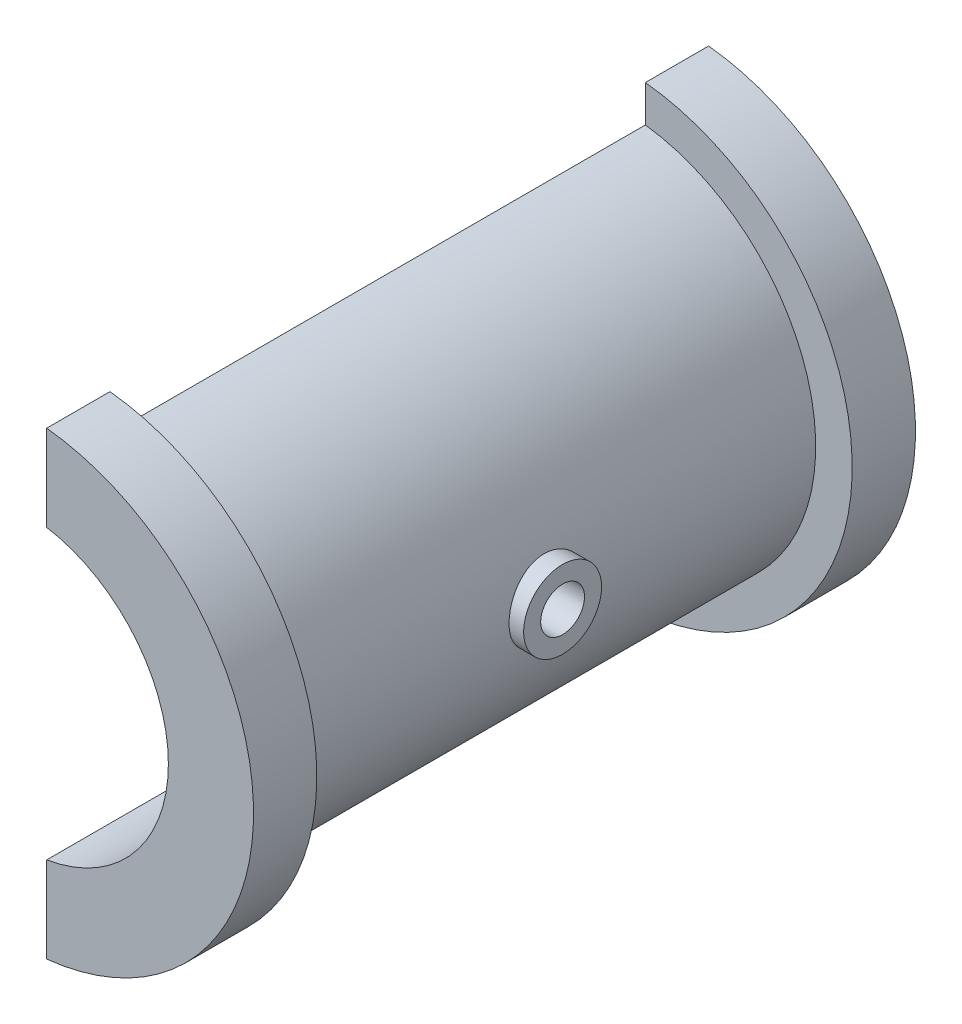
ISO-10303-21;
HEADER;
FILE_DESCRIPTION(('STEP AP214'),'2;1');
FILE_NAME('part.step','',(''),(''),'','','');
FILE_SCHEMA(('AUTOMOTIVE_DESIGN { 1 0 10303 214 1 1 1 1 }'));
ENDSEC;
DATA;
#1=APPLICATION_CONTEXT('core data for automotive mechanical design processes');
#2=APPLICATION_PROTOCOL_DEFINITION('international standard','automotive_design',2000,#1);
#3=PRODUCT_CONTEXT('',#1,'mechanical');
#4=PRODUCT('Part','Part','',(#3));
#5=PRODUCT_RELATED_PRODUCT_CATEGORY('part','',(#4));
#6=PRODUCT_DEFINITION_FORMATION('','',#4);
#7=PRODUCT_DEFINITION_CONTEXT('part definition',#1,'design');
#8=PRODUCT_DEFINITION('design','',#6,#7);
#9=PRODUCT_DEFINITION_SHAPE('','',#8);
#10=(LENGTH_UNIT() NAMED_UNIT(*) SI_UNIT(.MILLI.,.METRE.));
#11=(NAMED_UNIT(*) PLANE_ANGLE_UNIT() SI_UNIT($,.RADIAN.));
#12=(NAMED_UNIT(*) SI_UNIT($,.STERADIAN.) SOLID_ANGLE_UNIT());
#13=UNCERTAINTY_MEASURE_WITH_UNIT(LENGTH_MEASURE(1.E-05),#10,'distance_accuracy_value','');
#14=(GEOMETRIC_REPRESENTATION_CONTEXT(3) GLOBAL_UNCERTAINTY_ASSIGNED_CONTEXT((#13)) GLOBAL_UNIT_ASSIGNED_CONTEXT((#10,
#11,#12)) REPRESENTATION_CONTEXT('',''));
#15=CARTESIAN_POINT('',(0.,0.,0.));
#16=DIRECTION('',(0.,0.,1.));
#17=DIRECTION('',(1.,0.,0.));
#18=AXIS2_PLACEMENT_3D('',#15,#16,#17);
#19=CARTESIAN_POINT('',(0.,0.,55.));
#20=DIRECTION('',(0.,0.,-1.));
#21=DIRECTION('',(-1.,0.,0.));
#22=AXIS2_PLACEMENT_3D('',#19,#20,#21);
#23=CYLINDRICAL_SURFACE('',#22,30.);
#24=CARTESIAN_POINT('',(30.,0.,-4.50000000000001));
#25=CARTESIAN_POINT('',(29.9999959731389,0.251254633444927,-4.49998963855429));
#26=CARTESIAN_POINT('',(29.9968104761112,0.502655055246397,-4.47888599747811));
#27=CARTESIAN_POINT('',(29.9844094791956,0.998428883984741,-4.39505040005176));
#28=CARTESIAN_POINT('',(29.9751881081542,1.24279520692269,-4.33227791116533));
#29=CARTESIAN_POINT('',(29.9517516365858,1.71725425866558,-4.16702248509714));
#30=CARTESIAN_POINT('',(29.9375403111276,1.9473576234804,-4.06456956148216));
#31=CARTESIAN_POINT('',(29.9056942773517,2.38707128590577,-3.82293486174942));
#32=CARTESIAN_POINT('',(29.8880600445832,2.59668442417557,-3.68375818674792));
#33=CARTESIAN_POINT('',(29.8511751297436,2.99114015868638,-3.37146820518038));
#34=CARTESIAN_POINT('',(29.8319140167099,3.17579949667651,-3.19812463137539));
#35=CARTESIAN_POINT('',(29.7940278339972,3.51352472006846,-2.8229169333184));
#36=CARTESIAN_POINT('',(29.7754028009551,3.66658878818808,-2.62105116966444));
#37=CARTESIAN_POINT('',(29.7407963237618,3.93749188499829,-2.19329806943253));
#38=CARTESIAN_POINT('',(29.7248283592509,4.05515361111616,-1.967297259056));
#39=CARTESIAN_POINT('',(29.697486339188,4.25077896513169,-1.49846153806372));
#40=CARTESIAN_POINT('',(29.6861120332635,4.3287447566749,-1.25562754576833));
#41=CARTESIAN_POINT('',(29.6693476865602,4.44219596396734,-0.761945874384857));
#42=CARTESIAN_POINT('',(29.6639134722375,4.47799510921554,-0.511171819775932));
#43=CARTESIAN_POINT('',(29.6595104691175,4.50706872101798,-0.00712150203816632));
#44=CARTESIAN_POINT('',(29.6605413090944,4.50034562921389,0.246154616587482));
#45=CARTESIAN_POINT('',(29.6689115505723,4.44482199752363,0.745803240582428));
#46=CARTESIAN_POINT('',(29.6761985628465,4.39637087783252,0.99221557945441));
#47=CARTESIAN_POINT('',(29.696178243791,4.25931352211203,1.47337310661459));
#48=CARTESIAN_POINT('',(29.7088710653814,4.17070615013437,1.70811796464224));
#49=CARTESIAN_POINT('',(29.7382900663644,3.9554881058921,2.16034011384858));
#50=CARTESIAN_POINT('',(29.7550319029958,3.82872942849594,2.37774590727718));
#51=CARTESIAN_POINT('',(29.7906512272364,3.54091239386865,2.78833378734581));
#52=CARTESIAN_POINT('',(29.809528854975,3.37985178547435,2.98151428280812));
#53=CARTESIAN_POINT('',(29.8475241916863,3.02608479234744,3.34019298221916));
#54=CARTESIAN_POINT('',(29.8666424133844,2.83307798892601,3.50539497085903));
#55=CARTESIAN_POINT('',(29.9027894294539,2.42192126968256,3.80110780352179));
#56=CARTESIAN_POINT('',(29.9198182146753,2.20377124376451,3.9316184956317));
#57=CARTESIAN_POINT('',(29.9498854675618,1.74826379464106,4.15425925949865));
#58=CARTESIAN_POINT('',(29.9629215577628,1.51089503351034,4.2463664755209));
#59=CARTESIAN_POINT('',(29.9835147167121,1.02381954746118,4.38932816905614));
#60=CARTESIAN_POINT('',(29.991072155864,0.774113657857802,4.44018543544674));
#61=CARTESIAN_POINT('',(29.9998074340161,0.272008702930939,4.49880968945009));
#62=CARTESIAN_POINT('',(30.0010455627116,0.0196581956114106,4.50698391413798));
#63=CARTESIAN_POINT('',(29.9971668304568,-0.48281003298685,4.48109098406694));
#64=CARTESIAN_POINT('',(29.992050166241,-0.732927823145633,4.44702513699572));
#65=CARTESIAN_POINT('',(29.97607405846,-1.22259716229423,4.33795769946738));
#66=CARTESIAN_POINT('',(29.9652424562395,-1.46219388923952,4.26315451190747));
#67=CARTESIAN_POINT('',(29.9390470697511,-1.925444875929,4.07494500761474));
#68=CARTESIAN_POINT('',(29.923683072647,-2.14909838638531,3.96153687799912));
#69=CARTESIAN_POINT('',(29.8899804740606,-2.57590493787577,3.69838132630843));
#70=CARTESIAN_POINT('',(29.8716210488024,-2.77889702967471,3.54837557996169));
#71=CARTESIAN_POINT('',(29.8340358903649,-3.15697101953313,3.21664256511377));
#72=CARTESIAN_POINT('',(29.814810106886,-3.33205129438022,3.03491345302606));
#73=CARTESIAN_POINT('',(29.7774679291348,-3.65081354871587,2.64307940047054));
#74=CARTESIAN_POINT('',(29.7593620805276,-3.79422254242264,2.4327512244157));
#75=CARTESIAN_POINT('',(29.7264965731471,-4.04367387811753,1.9907518784647));
#76=CARTESIAN_POINT('',(29.7117368239688,-4.14971722969308,1.75908128543561));
#77=CARTESIAN_POINT('',(29.6873109902593,-4.32100401971831,1.28178739913061));
#78=CARTESIAN_POINT('',(29.6776269901931,-4.38639111424907,1.03621661708627));
#79=CARTESIAN_POINT('',(29.6644014689341,-4.4749664850476,0.537422953694681));
#80=CARTESIAN_POINT('',(29.6608595235531,-4.49815767549201,0.284200602015978));
#81=CARTESIAN_POINT('',(29.6603349783252,-4.5016136000832,-0.219987189947346));
#82=CARTESIAN_POINT('',(29.6632867900051,-4.48230756501939,-0.470949725270765));
#83=CARTESIAN_POINT('',(29.6752746183352,-4.40223688633137,-0.966015789970552));
#84=CARTESIAN_POINT('',(29.6843106252335,-4.34147230915882,-1.21011933034018));
#85=CARTESIAN_POINT('',(29.7074257833689,-4.18036120555996,-1.68441924670298));
#86=CARTESIAN_POINT('',(29.7215011114823,-4.08004467972943,-1.91462601130032));
#87=CARTESIAN_POINT('',(29.7531136367311,-3.84272002926928,-2.35501090140721));
#88=CARTESIAN_POINT('',(29.7706509510817,-3.70571066224506,-2.56518834841094));
#89=CARTESIAN_POINT('',(29.8074223009481,-3.39733012977493,-2.96172917392552));
#90=CARTESIAN_POINT('',(29.826671036459,-3.22564107119417,-3.14784399974121));
#91=CARTESIAN_POINT('',(29.8645736647991,-2.85344652324851,-3.48877366436348));
#92=CARTESIAN_POINT('',(29.8832274183228,-2.65293434505283,-3.64358121772849));
#93=CARTESIAN_POINT('',(29.9179555737156,-2.22748712263117,-3.9182630298221));
#94=CARTESIAN_POINT('',(29.9340152138646,-2.00242373029428,-4.03794032764425));
#95=CARTESIAN_POINT('',(29.9616008640888,-1.53525561074616,-4.23761555027415));
#96=CARTESIAN_POINT('',(29.9731315669727,-1.29316883129011,-4.31765457016107));
#97=CARTESIAN_POINT('',(29.9877281778452,-0.874997183667988,-4.41762402813033));
#98=CARTESIAN_POINT('',(29.9923064753867,-0.701493400485836,-4.44846780461644));
#99=CARTESIAN_POINT('',(29.9984437784369,-0.352016914800376,-4.48965929313794));
#100=CARTESIAN_POINT('',(30.0000028214632,-0.176044243003252,-4.50000725985765));
#101=CARTESIAN_POINT('',(30.,0.,-4.50000000000001));
#102=B_SPLINE_CURVE_WITH_KNOTS('',3,(#24,#25,#26,#27,#28,#29,#30,#31,#32,#33,#34,#35,#36,#37,
#38,#39,#40,#41,#42,#43,#44,#45,#46,#47,#48,#49,#50,#51,#52,#53,#54,#55,#56,#57,#58,#59,#60,#61,
#62,#63,#64,#65,#66,#67,#68,#69,#70,#71,#72,#73,#74,#75,#76,#77,#78,#79,#80,#81,#82,#83,#84,#85,
#86,#87,#88,#89,#90,#91,#92,#93,#94,#95,#96,#97,#98,#99,#100,#101),.UNSPECIFIED.,.T.,.F.,(4,2,2,
2,2,2,2,2,2,2,2,2,2,2,2,2,2,2,2,2,2,2,2,2,2,2,2,2,2,2,2,2,2,2,2,2,2,2,4),(0.,0.753120615094991,
1.50697488878745,2.26026007074972,3.0134406725928,3.77188248410531,4.53036790717741,
5.29259107186126,6.05477268676519,6.81124693817774,7.56767775296949,8.31783531587241,
9.06801410071086,9.82114150428479,10.5743183492561,11.3350287376623,12.0957424571601,
12.8569082695463,13.6180226158021,14.3718617563277,15.1256775597347,15.8758544689785,
16.6260666112882,17.3817356411073,18.1374486008589,18.8994409975402,19.661412804265,
20.4206767037151,21.1798881641153,21.931466647832,22.683043926887,23.4340522195244,
24.1850859440064,24.9433448989717,25.701780104062,26.4643897015421,27.2262069978433,
27.7538955593643,28.2815775636988),.UNSPECIFIED.);
#103=CARTESIAN_POINT('',(30.,0.,-4.50000000000001));
#104=VERTEX_POINT('',#103);
#105=EDGE_CURVE('E49',#104,#104,#102,.T.);
#106=ORIENTED_EDGE('',*,*,#105,.T.);
#107=EDGE_LOOP('',(#106));
#108=FACE_BOUND('',#107,.T.);
#109=DIRECTION('',(0.,0.,-1.));
#110=VECTOR('',#109,1.);
#111=CARTESIAN_POINT('',(5.,29.5803989154981,55.));
#112=LINE('',#111,#110);
#113=CARTESIAN_POINT('',(5.,29.5803989154981,68.));
#114=VERTEX_POINT('',#113);
#115=CARTESIAN_POINT('',(5.,29.5803989154981,-68.));
#116=VERTEX_POINT('',#115);
#117=EDGE_CURVE('E111',#114,#116,#112,.T.);
#118=ORIENTED_EDGE('',*,*,#117,.T.);
#119=CARTESIAN_POINT('',(0.,0.,-68.));
#120=DIRECTION('',(0.,0.,-1.));
#121=DIRECTION('',(1.,0.,0.));
#122=AXIS2_PLACEMENT_3D('',#119,#120,#121);
#123=CIRCLE('',#122,30.);
#124=CARTESIAN_POINT('',(5.,-29.5803989154981,-68.));
#125=VERTEX_POINT('',#124);
#126=EDGE_CURVE('E113',#116,#125,#123,.T.);
#127=ORIENTED_EDGE('',*,*,#126,.T.);
#128=DIRECTION('',(0.,0.,-1.));
#129=VECTOR('',#128,1.);
#130=CARTESIAN_POINT('',(5.,-29.5803989154981,55.));
#131=LINE('',#130,#129);
#132=CARTESIAN_POINT('',(5.,-29.5803989154981,68.));
#133=VERTEX_POINT('',#132);
#134=EDGE_CURVE('E11',#133,#125,#131,.T.);
#135=ORIENTED_EDGE('',*,*,#134,.F.);
#136=CARTESIAN_POINT('',(0.,0.,68.));
#137=DIRECTION('',(0.,0.,-1.));
#138=DIRECTION('',(1.,0.,0.));
#139=AXIS2_PLACEMENT_3D('',#136,#137,#138);
#140=CIRCLE('',#139,30.);
#141=EDGE_CURVE('E116',#114,#133,#140,.T.);
#142=ORIENTED_EDGE('',*,*,#141,.F.);
#143=EDGE_LOOP('',(#118,#127,#135,#142));
#144=FACE_BOUND('',#143,.T.);
#145=ADVANCED_FACE('F45',(#108,#144),#23,.F.);
#146=CARTESIAN_POINT('',(5.,-29.5803989154981,55.));
#147=DIRECTION('',(1.,0.,0.));
#148=DIRECTION('',(0.,1.,0.));
#149=AXIS2_PLACEMENT_3D('',#146,#147,#148);
#150=PLANE('',#149);
#151=ORIENTED_EDGE('',*,*,#134,.T.);
#152=DIRECTION('',(0.,-1.,0.));
#153=VECTOR('',#152,1.);
#154=CARTESIAN_POINT('',(5.,-29.5803989154981,-68.));
#155=LINE('',#154,#153);
#156=CARTESIAN_POINT('',(5.,-47.236109069228,-68.));
#157=VERTEX_POINT('',#156);
#158=EDGE_CURVE('E132',#125,#157,#155,.T.);
#159=ORIENTED_EDGE('',*,*,#158,.T.);
#160=DIRECTION('',(0.,0.,1.));
#161=VECTOR('',#160,1.);
#162=CARTESIAN_POINT('',(5.,-47.236109069228,-68.));
#163=LINE('',#162,#161);
#164=CARTESIAN_POINT('',(5.,-47.236109069228,-55.));
#165=VERTEX_POINT('',#164);
#166=EDGE_CURVE('E149',#157,#165,#163,.T.);
#167=ORIENTED_EDGE('',*,*,#166,.T.);
#168=DIRECTION('',(0.,-1.,0.));
#169=VECTOR('',#168,1.);
#170=CARTESIAN_POINT('',(5.,-29.5803989154981,-55.));
#171=LINE('',#170,#169);
#172=CARTESIAN_POINT('',(5.,-39.6862696659689,-55.));
#173=VERTEX_POINT('',#172);
#174=EDGE_CURVE('E134',#173,#165,#171,.T.);
#175=ORIENTED_EDGE('',*,*,#174,.F.);
#176=DIRECTION('',(0.,0.,-1.));
#177=VECTOR('',#176,1.);
#178=CARTESIAN_POINT('',(5.00000000000001,-39.6862696659689,55.));
#179=LINE('',#178,#177);
#180=CARTESIAN_POINT('',(5.00000000000001,-39.6862696659689,55.));
#181=VERTEX_POINT('',#180);
#182=EDGE_CURVE('E60',#181,#173,#179,.T.);
#183=ORIENTED_EDGE('',*,*,#182,.F.);
#184=DIRECTION('',(0.,-1.,0.));
#185=VECTOR('',#184,1.);
#186=CARTESIAN_POINT('',(5.,-29.5803989154981,55.));
#187=LINE('',#186,#185);
#188=CARTESIAN_POINT('',(5.,-47.236109069228,55.));
#189=VERTEX_POINT('',#188);
#190=EDGE_CURVE('E165',#181,#189,#187,.T.);
#191=ORIENTED_EDGE('',*,*,#190,.T.);
#192=DIRECTION('',(0.,0.,-1.));
#193=VECTOR('',#192,1.);
#194=CARTESIAN_POINT('',(5.,-47.236109069228,68.));
#195=LINE('',#194,#193);
#196=CARTESIAN_POINT('',(5.,-47.236109069228,68.));
#197=VERTEX_POINT('',#196);
#198=EDGE_CURVE('E190',#197,#189,#195,.T.);
#199=ORIENTED_EDGE('',*,*,#198,.F.);
#200=DIRECTION('',(0.,-1.,0.));
#201=VECTOR('',#200,1.);
#202=CARTESIAN_POINT('',(5.,-29.5803989154981,68.));
#203=LINE('',#202,#201);
#204=EDGE_CURVE('E168',#133,#197,#203,.T.);
#205=ORIENTED_EDGE('',*,*,#204,.F.);
#206=EDGE_LOOP('',(#151,#159,#167,#175,#183,#191,#199,#205));
#207=FACE_BOUND('',#206,.T.);
#208=ADVANCED_FACE('F212',(#207),#150,.F.);
#209=CARTESIAN_POINT('',(0.,0.,55.));
#210=DIRECTION('',(0.,0.,-1.));
#211=DIRECTION('',(-1.,0.,0.));
#212=AXIS2_PLACEMENT_3D('',#209,#210,#211);
#213=CYLINDRICAL_SURFACE('',#212,40.);
#214=CARTESIAN_POINT('',(40.,0.,-8.));
#215=CARTESIAN_POINT('',(40.0000022503977,0.222382202996885,-8.00000443100729));
#216=CARTESIAN_POINT('',(39.9981422711815,0.444708909688722,-7.99072501381524));
#217=CARTESIAN_POINT('',(39.9907591944899,0.887823377686245,-7.95368960994421));
#218=CARTESIAN_POINT('',(39.9852354787933,1.10861087290957,-7.92593050498773));
#219=CARTESIAN_POINT('',(39.9706723880411,1.54709944124005,-7.85213029959485));
#220=CARTESIAN_POINT('',(39.961631196122,1.76479885895029,-7.80607975091755));
#221=CARTESIAN_POINT('',(39.9402820100275,2.19553774317657,-7.69604055574548));
#222=CARTESIAN_POINT('',(39.9279728152493,2.40857546587516,-7.6320453162221));
#223=CARTESIAN_POINT('',(39.9004487443211,2.82813260013869,-7.48671418033354));
#224=CARTESIAN_POINT('',(39.8852377987276,3.03466039373949,-7.40540172379848));
#225=CARTESIAN_POINT('',(39.8523111594353,3.44015899794314,-7.22595890507998));
#226=CARTESIAN_POINT('',(39.8345945304007,3.63912695121905,-7.1278222597515));
#227=CARTESIAN_POINT('',(39.7971537912997,4.02798849333058,-6.91551569000785));
#228=CARTESIAN_POINT('',(39.7774306699057,4.21788648413403,-6.80135365145924));
#229=CARTESIAN_POINT('',(39.7364958380736,4.58753748621129,-6.55770727039044));
#230=CARTESIAN_POINT('',(39.7152834516751,4.76728582301152,-6.42821595154674));
#231=CARTESIAN_POINT('',(39.6716894668911,5.11747697068662,-6.15317791835462));
#232=CARTESIAN_POINT('',(39.6492968025577,5.2877803632885,-6.00745541560296));
#233=CARTESIAN_POINT('',(39.6042147817473,5.61547151660434,-5.70233102363309));
#234=CARTESIAN_POINT('',(39.5815255597968,5.77286491297785,-5.54293516614664));
#235=CARTESIAN_POINT('',(39.5364613058424,6.07382890620943,-5.21140561166009));
#236=CARTESIAN_POINT('',(39.5140864286214,6.21739288410144,-5.03926588427414));
#237=CARTESIAN_POINT('',(39.4702971900764,6.48957938998095,-4.68353492782497));
#238=CARTESIAN_POINT('',(39.4488824945439,6.61820714196465,-4.4999477372902));
#239=CARTESIAN_POINT('',(39.4074190918586,6.86080252294502,-4.12074265124599));
#240=CARTESIAN_POINT('',(39.3873849607066,6.97462249301908,-3.92502865026222));
#241=CARTESIAN_POINT('',(39.3494895115417,7.18534213767996,-3.52449493567151));
#242=CARTESIAN_POINT('',(39.331628159576,7.28224207667738,-3.31967536442076));
#243=CARTESIAN_POINT('',(39.2986075122845,7.4583833678868,-2.90237907956402));
#244=CARTESIAN_POINT('',(39.2834480695741,7.53762568335291,-2.6899027843806));
#245=CARTESIAN_POINT('',(39.2562856809014,7.67783429716927,-2.25881195596571));
#246=CARTESIAN_POINT('',(39.244282621556,7.73880125201603,-2.04019764353573));
#247=CARTESIAN_POINT('',(39.2239295795769,7.84130382956527,-1.60127653730711));
#248=CARTESIAN_POINT('',(39.2155344264807,7.88308020170019,-1.38102805091707));
#249=CARTESIAN_POINT('',(39.2024281229502,7.9480015554449,-0.937775607562832));
#250=CARTESIAN_POINT('',(39.1977155964609,7.97115349637861,-0.714772711485412));
#251=CARTESIAN_POINT('',(39.1921111780117,7.99866360552878,-0.267541765716385));
#252=CARTESIAN_POINT('',(39.1912196424865,8.00302002043607,-0.0433136036812819));
#253=CARTESIAN_POINT('',(39.1932851968663,7.9928982430403,0.404698313098166));
#254=CARTESIAN_POINT('',(39.1962422545112,7.97842020861341,0.628482071551891));
#255=CARTESIAN_POINT('',(39.205841404869,7.93111398129365,1.07055692502244));
#256=CARTESIAN_POINT('',(39.2124264980905,7.89856956782374,1.28887969863994));
#257=CARTESIAN_POINT('',(39.2290525306891,7.81557589995774,1.72203913505801));
#258=CARTESIAN_POINT('',(39.2390946679849,7.76512043892019,1.93687456238231));
#259=CARTESIAN_POINT('',(39.2623403346724,7.64671600346994,2.36141550199566));
#260=CARTESIAN_POINT('',(39.2755428277978,7.57877276267294,2.57112267102709));
#261=CARTESIAN_POINT('',(39.3047394534056,7.42586773982546,2.98412380399879));
#262=CARTESIAN_POINT('',(39.3207346248761,7.34089962209752,3.18741534771573));
#263=CARTESIAN_POINT('',(39.3551749086605,7.15397048373112,3.587445735331));
#264=CARTESIAN_POINT('',(39.3736353766776,7.05190184161522,3.78413295862283));
#265=CARTESIAN_POINT('',(39.4124052045585,6.83189481273278,4.16823715731557));
#266=CARTESIAN_POINT('',(39.4327146319165,6.7139558465627,4.35565379391841));
#267=CARTESIAN_POINT('',(39.4746189126864,6.46302077871785,4.71998871872312));
#268=CARTESIAN_POINT('',(39.4962138687299,6.33002347407536,4.89690616645156));
#269=CARTESIAN_POINT('',(39.5400941887543,6.04987994409967,5.23906893990563));
#270=CARTESIAN_POINT('',(39.5623795608308,5.9027335528142,5.40431412868984));
#271=CARTESIAN_POINT('',(39.6074360180536,5.59249627412449,5.72491347445412));
#272=CARTESIAN_POINT('',(39.6302086182823,5.42916581642201,5.88003568903051));
#273=CARTESIAN_POINT('',(39.6751996579545,5.08996999143125,6.17599109660391));
#274=CARTESIAN_POINT('',(39.6974181077143,4.91410485772875,6.31682455575579));
#275=CARTESIAN_POINT('',(39.7406835999453,4.55098875723055,6.58325307433265));
#276=CARTESIAN_POINT('',(39.7617303798239,4.36373525761476,6.70884472517423));
#277=CARTESIAN_POINT('',(39.8020486554585,3.97922978106771,6.94380829067182));
#278=CARTESIAN_POINT('',(39.8213208252184,3.78198164463424,7.05318637301079));
#279=CARTESIAN_POINT('',(39.8575916354611,3.37838910085915,7.25517100915874));
#280=CARTESIAN_POINT('',(39.8745857688793,3.17202770440714,7.34774443964797));
#281=CARTESIAN_POINT('',(39.9057672288933,2.7520988608886,7.51511949856216));
#282=CARTESIAN_POINT('',(39.9199555712297,2.53853405446499,7.58992756030767));
#283=CARTESIAN_POINT('',(39.9451283654844,2.10564163314498,7.72123281973584));
#284=CARTESIAN_POINT('',(39.9561125476091,1.88631353466729,7.77772847553919));
#285=CARTESIAN_POINT('',(39.9745588864157,1.44351590634491,7.87194359431046));
#286=CARTESIAN_POINT('',(39.9820210973501,1.22004644034896,7.90966334650283));
#287=CARTESIAN_POINT('',(39.9931141484704,0.774384931428699,7.96554555984256));
#288=CARTESIAN_POINT('',(39.9968070216775,0.552234104223998,7.98402477348316));
#289=CARTESIAN_POINT('',(40.0004756324195,0.107135261602876,8.00238295431595));
#290=CARTESIAN_POINT('',(40.0004514055167,-0.115812746166326,8.00226209945932));
#291=CARTESIAN_POINT('',(39.9966866100009,-0.560877232390089,7.98342182938795));
#292=CARTESIAN_POINT('',(39.99294623992,-0.782993754629819,7.96470340773397));
#293=CARTESIAN_POINT('',(39.9818545211136,-1.22480186071782,7.90882035880861));
#294=CARTESIAN_POINT('',(39.9745031795073,-1.44449344934609,7.87165576790473));
#295=CARTESIAN_POINT('',(39.9564787248489,-1.87787554125075,7.77960195922915));
#296=CARTESIAN_POINT('',(39.9458367537215,-2.09160263678705,7.72487873749604));
#297=CARTESIAN_POINT('',(39.9214968946398,-2.51372209762288,7.59801211562015));
#298=CARTESIAN_POINT('',(39.9077979640979,-2.72211261576743,7.52586277153862));
#299=CARTESIAN_POINT('',(39.877722916677,-3.13200198992557,7.3647162026783));
#300=CARTESIAN_POINT('',(39.861347575322,-3.33350282192162,7.27572385719616));
#301=CARTESIAN_POINT('',(39.8263526743327,-3.72839698843742,7.08148934994883));
#302=CARTESIAN_POINT('',(39.8077323215374,-3.92178742484404,6.97624144139211));
#303=CARTESIAN_POINT('',(39.7685164512439,-4.30138936968721,6.74889500361166));
#304=CARTESIAN_POINT('',(39.7478998165188,-4.48748613441774,6.62660851709688));
#305=CARTESIAN_POINT('',(39.7054488099911,-4.84875465286749,6.36702869354888));
#306=CARTESIAN_POINT('',(39.6836144213363,-5.023926255326,6.2297351488128));
#307=CARTESIAN_POINT('',(39.6393195903224,-5.36222509348534,5.94104379760852));
#308=CARTESIAN_POINT('',(39.6168589921477,-5.52534929399764,5.78964245844431));
#309=CARTESIAN_POINT('',(39.5719396753391,-5.83837217393115,5.47383100242076));
#310=CARTESIAN_POINT('',(39.5494809583073,-5.98827496622159,5.30942496142015));
#311=CARTESIAN_POINT('',(39.5048345293274,-6.2761128272644,4.96602168373043));
#312=CARTESIAN_POINT('',(39.4826563408313,-6.41382763461222,4.78683849920848));
#313=CARTESIAN_POINT('',(39.4395671785454,-6.67367154431948,4.41736517310698));
#314=CARTESIAN_POINT('',(39.41865619115,-6.79580081403156,4.22707515082117));
#315=CARTESIAN_POINT('',(39.3787064281191,-7.02359296525607,3.8366929245437));
#316=CARTESIAN_POINT('',(39.3596676472848,-7.12925589249241,3.63660074777279));
#317=CARTESIAN_POINT('',(39.3240213544226,-7.32332467616792,3.22801249016853));
#318=CARTESIAN_POINT('',(39.3074137624426,-7.41173110013704,3.01951668598491));
#319=CARTESIAN_POINT('',(39.277199690298,-7.57020898101907,2.59666286196399));
#320=CARTESIAN_POINT('',(39.2635784845912,-7.64037073468745,2.38233974509702));
#321=CARTESIAN_POINT('',(39.2396423236709,-7.76236677307734,1.94844277944978));
#322=CARTESIAN_POINT('',(39.2293261354949,-7.81420789319936,1.72887092168049));
#323=CARTESIAN_POINT('',(39.2123039242266,-7.89918364314085,1.28598005737815));
#324=CARTESIAN_POINT('',(39.2055981765014,-7.93231684612348,1.06266076636875));
#325=CARTESIAN_POINT('',(39.1960025280241,-7.97959714844253,0.613940864784894));
#326=CARTESIAN_POINT('',(39.193112573146,-7.99374451708801,0.388540283778642));
#327=CARTESIAN_POINT('',(39.1912538071164,-8.00285222304826,-0.0585254711402085));
#328=CARTESIAN_POINT('',(39.1922140705528,-7.99815961215707,-0.280183357044461));
#329=CARTESIAN_POINT('',(39.1978690026941,-7.97039936405038,-0.722375483493523));
#330=CARTESIAN_POINT('',(39.2025649688353,-7.94732534283514,-0.942909306857521));
#331=CARTESIAN_POINT('',(39.2155532178888,-7.88298545810057,-1.38115178257743));
#332=CARTESIAN_POINT('',(39.2238447650534,-7.84172331630651,-1.59886100353747));
#333=CARTESIAN_POINT('',(39.2437816557745,-7.74133170814247,-2.02996747202559));
#334=CARTESIAN_POINT('',(39.2554270856983,-7.68220178164945,-2.24336460835986));
#335=CARTESIAN_POINT('',(39.2817018891557,-7.5466974708152,-2.66383702290788));
#336=CARTESIAN_POINT('',(39.2963238364281,-7.47036595381018,-2.87092658799139));
#337=CARTESIAN_POINT('',(39.3281533929634,-7.3009434128743,-3.27792855697227));
#338=CARTESIAN_POINT('',(39.3453610481826,-7.20785209106253,-3.47784083322813));
#339=CARTESIAN_POINT('',(39.3818768388285,-7.00559277336041,-3.86913031730106));
#340=CARTESIAN_POINT('',(39.4011847520438,-6.89642647780227,-4.06050842503486));
#341=CARTESIAN_POINT('',(39.4413744461936,-6.66273496653415,-4.43355661666274));
#342=CARTESIAN_POINT('',(39.4622567439425,-6.53820469876637,-4.61522347896127));
#343=CARTESIAN_POINT('',(39.5053786272049,-6.27243809241453,-4.97057043512849));
#344=CARTESIAN_POINT('',(39.5276351458069,-6.13095577146573,-5.14406455077253));
#345=CARTESIAN_POINT('',(39.5725558604418,-5.83398396014617,-5.47856305349385));
#346=CARTESIAN_POINT('',(39.5952200605015,-5.67849433136303,-5.63956731712415));
#347=CARTESIAN_POINT('',(39.640335009379,-5.35449315031708,-5.94806346904203));
#348=CARTESIAN_POINT('',(39.6627856688701,-5.18597639634956,-6.0955499077774));
#349=CARTESIAN_POINT('',(39.7068343062859,-4.83716807079332,-6.3758804430836));
#350=CARTESIAN_POINT('',(39.7284325782508,-4.65688061761436,-6.50872961777478));
#351=CARTESIAN_POINT('',(39.7704137619116,-4.28366939255559,-6.7602783089246));
#352=CARTESIAN_POINT('',(39.7907809287494,-4.09062965973461,-6.87880850451553));
#353=CARTESIAN_POINT('',(39.8294566689227,-3.69511146732796,-7.09911105122752));
#354=CARTESIAN_POINT('',(39.8477659996985,-3.49263651969487,-7.20088957468729));
#355=CARTESIAN_POINT('',(39.8818029524045,-3.07971732211681,-7.38691920570563));
#356=CARTESIAN_POINT('',(39.8975321343332,-2.86927798300794,-7.47118091250707));
#357=CARTESIAN_POINT('',(39.925969672351,-2.44189507967102,-7.6215802891145));
#358=CARTESIAN_POINT('',(39.9386786103523,-2.22495277745859,-7.68772145059331));
#359=CARTESIAN_POINT('',(39.9660939650464,-1.6787234509097,-7.82915700351603));
#360=CARTESIAN_POINT('',(39.9787427045036,-1.34633199046821,-7.89313569708758));
#361=CARTESIAN_POINT('',(39.9956938793146,-0.675917525830283,-7.97855315112737));
#362=CARTESIAN_POINT('',(39.999996580673,-0.337894701462863,-7.99999326738442));
#363=CARTESIAN_POINT('',(40.,0.,-8.));
#364=B_SPLINE_CURVE_WITH_KNOTS('',3,(#214,#215,#216,#217,#218,#219,#220,#221,#222,#223,#224,
#225,#226,#227,#228,#229,#230,#231,#232,#233,#234,#235,#236,#237,#238,#239,#240,#241,#242,#243,
#244,#245,#246,#247,#248,#249,#250,#251,#252,#253,#254,#255,#256,#257,#258,#259,#260,#261,#262,
#263,#264,#265,#266,#267,#268,#269,#270,#271,#272,#273,#274,#275,#276,#277,#278,#279,#280,#281,
#282,#283,#284,#285,#286,#287,#288,#289,#290,#291,#292,#293,#294,#295,#296,#297,#298,#299,#300,
#301,#302,#303,#304,#305,#306,#307,#308,#309,#310,#311,#312,#313,#314,#315,#316,#317,#318,#319,
#320,#321,#322,#323,#324,#325,#326,#327,#328,#329,#330,#331,#332,#333,#334,#335,#336,#337,#338,
#339,#340,#341,#342,#343,#344,#345,#346,#347,#348,#349,#350,#351,#352,#353,#354,#355,#356,#357,
#358,#359,#360,#361,#362,#363),.UNSPECIFIED.,.T.,.F.,(4,2,2,2,2,2,2,2,2,2,2,2,2,2,2,2,2,2,2,2,2,
2,2,2,2,2,2,2,2,2,2,2,2,2,2,2,2,2,2,2,2,2,2,2,2,2,2,2,2,2,2,2,2,2,2,2,2,2,2,2,2,2,2,2,2,2,2,2,2,
2,2,2,2,2,4),(0.,0.666849907451946,1.33381236822939,2.00111978996802,2.66867270797161,
3.33532773384513,4.00223227257719,4.66880978011991,5.33569182042637,6.0106677572235,
6.68534745793188,7.36034848251392,8.035112707519,8.71615994590496,9.39719654056212,
10.0781959743874,10.7591709420826,11.4313525330265,12.1032828354814,12.7752758164746,
13.4472631646517,14.1089822352936,14.7709308329132,15.4326626771736,16.0946412387773,
16.7609542304084,17.4272915548062,18.0936821486017,18.7600805593353,19.438489468032,
20.1168857377692,20.7954334413593,21.4737223575914,22.1533340527271,22.8326992655184,
23.5121216650733,24.191533598466,24.8595746436197,25.52760929747,26.1956082640004,
26.8636059135443,27.5254658280727,28.1875518183939,28.8494462999214,29.5115753173536,
30.1816917593008,30.8518174770647,31.5221114525292,32.1921961744184,32.8726166625244,
33.5530298438726,34.2334411358085,34.913830046682,35.5907845633699,36.2674862420433,
36.944239525206,37.6209832087002,38.2853183063896,38.9498842332148,39.6143142370088,
40.2787613523593,40.9415705881075,41.604391605479,42.2671425631759,42.9301120336978,
43.6042441680847,44.2783829645991,44.9527923477468,45.6269670157198,46.3084627219637,
46.9897067587031,47.6705373741926,48.3512367070753,49.3645022888653,50.3777355753535),.UNSPECIFIED.);
#365=CARTESIAN_POINT('',(40.,0.,-8.));
#366=VERTEX_POINT('',#365);
#367=EDGE_CURVE('E154',#366,#366,#364,.T.);
#368=ORIENTED_EDGE('',*,*,#367,.F.);
#369=EDGE_LOOP('',(#368));
#370=FACE_BOUND('',#369,.T.);
#371=CARTESIAN_POINT('',(0.,0.,-55.));
#372=DIRECTION('',(0.,0.,1.));
#373=DIRECTION('',(-1.,0.,0.));
#374=AXIS2_PLACEMENT_3D('',#371,#372,#373);
#375=CIRCLE('',#374,40.);
#376=CARTESIAN_POINT('',(4.99999999999999,39.6862696659689,-55.));
#377=VERTEX_POINT('',#376);
#378=EDGE_CURVE('E194',#173,#377,#375,.T.);
#379=ORIENTED_EDGE('',*,*,#378,.T.);
#380=DIRECTION('',(0.,0.,-1.));
#381=VECTOR('',#380,1.);
#382=CARTESIAN_POINT('',(4.99999999999999,39.6862696659689,55.));
#383=LINE('',#382,#381);
#384=CARTESIAN_POINT('',(5.,39.6862696659689,55.));
#385=VERTEX_POINT('',#384);
#386=EDGE_CURVE('E122',#385,#377,#383,.T.);
#387=ORIENTED_EDGE('',*,*,#386,.F.);
#388=CARTESIAN_POINT('',(0.,0.,55.));
#389=DIRECTION('',(0.,0.,1.));
#390=DIRECTION('',(-1.,0.,0.));
#391=AXIS2_PLACEMENT_3D('',#388,#389,#390);
#392=CIRCLE('',#391,40.);
#393=EDGE_CURVE('E123',#181,#385,#392,.T.);
#394=ORIENTED_EDGE('',*,*,#393,.F.);
#395=ORIENTED_EDGE('',*,*,#182,.T.);
#396=EDGE_LOOP('',(#379,#387,#394,#395));
#397=FACE_BOUND('',#396,.T.);
#398=ADVANCED_FACE('F205',(#370,#397),#213,.T.);
#399=CARTESIAN_POINT('',(4.99999999999999,39.6862696659689,55.));
#400=DIRECTION('',(1.,0.,0.));
#401=DIRECTION('',(0.,1.,0.));
#402=AXIS2_PLACEMENT_3D('',#399,#400,#401);
#403=PLANE('',#402);
#404=ORIENTED_EDGE('',*,*,#386,.T.);
#405=DIRECTION('',(0.,-1.,0.));
#406=VECTOR('',#405,1.);
#407=CARTESIAN_POINT('',(5.,29.5803989154981,-55.));
#408=LINE('',#407,#406);
#409=CARTESIAN_POINT('',(5.,47.236109069228,-55.));
#410=VERTEX_POINT('',#409);
#411=EDGE_CURVE('E150',#410,#377,#408,.T.);
#412=ORIENTED_EDGE('',*,*,#411,.F.);
#413=DIRECTION('',(0.,0.,1.));
#414=VECTOR('',#413,1.);
#415=CARTESIAN_POINT('',(5.,47.236109069228,-68.));
#416=LINE('',#415,#414);
#417=CARTESIAN_POINT('',(5.,47.236109069228,-68.));
#418=VERTEX_POINT('',#417);
#419=EDGE_CURVE('E139',#418,#410,#416,.T.);
#420=ORIENTED_EDGE('',*,*,#419,.F.);
#421=DIRECTION('',(0.,-1.,0.));
#422=VECTOR('',#421,1.);
#423=CARTESIAN_POINT('',(5.,29.5803989154981,-68.));
#424=LINE('',#423,#422);
#425=EDGE_CURVE('E129',#418,#116,#424,.T.);
#426=ORIENTED_EDGE('',*,*,#425,.T.);
#427=ORIENTED_EDGE('',*,*,#117,.F.);
#428=DIRECTION('',(0.,-1.,0.));
#429=VECTOR('',#428,1.);
#430=CARTESIAN_POINT('',(5.,29.5803989154981,68.));
#431=LINE('',#430,#429);
#432=CARTESIAN_POINT('',(5.,47.236109069228,68.));
#433=VERTEX_POINT('',#432);
#434=EDGE_CURVE('E175',#433,#114,#431,.T.);
#435=ORIENTED_EDGE('',*,*,#434,.F.);
#436=DIRECTION('',(0.,0.,-1.));
#437=VECTOR('',#436,1.);
#438=CARTESIAN_POINT('',(5.,47.236109069228,68.));
#439=LINE('',#438,#437);
#440=CARTESIAN_POINT('',(5.,47.236109069228,55.));
#441=VERTEX_POINT('',#440);
#442=EDGE_CURVE('E178',#433,#441,#439,.T.);
#443=ORIENTED_EDGE('',*,*,#442,.T.);
#444=DIRECTION('',(0.,-1.,0.));
#445=VECTOR('',#444,1.);
#446=CARTESIAN_POINT('',(5.,29.5803989154981,55.));
#447=LINE('',#446,#445);
#448=EDGE_CURVE('E169',#441,#385,#447,.T.);
#449=ORIENTED_EDGE('',*,*,#448,.T.);
#450=EDGE_LOOP('',(#404,#412,#420,#426,#427,#435,#443,#449));
#451=FACE_BOUND('',#450,.T.);
#452=ADVANCED_FACE('F137',(#451),#403,.F.);
#453=CARTESIAN_POINT('',(0.,0.,68.));
#454=DIRECTION('',(0.,0.,-1.));
#455=DIRECTION('',(-1.,0.,0.));
#456=AXIS2_PLACEMENT_3D('',#453,#454,#455);
#457=CYLINDRICAL_SURFACE('',#456,47.5);
#458=CARTESIAN_POINT('',(0.,0.,55.));
#459=DIRECTION('',(0.,0.,1.));
#460=DIRECTION('',(-1.,0.,0.));
#461=AXIS2_PLACEMENT_3D('',#458,#459,#460);
#462=CIRCLE('',#461,47.5);
#463=EDGE_CURVE('E181',#189,#441,#462,.T.);
#464=ORIENTED_EDGE('',*,*,#463,.T.);
#465=ORIENTED_EDGE('',*,*,#442,.F.);
#466=CARTESIAN_POINT('',(0.,0.,68.));
#467=DIRECTION('',(0.,0.,1.));
#468=DIRECTION('',(-1.,0.,0.));
#469=AXIS2_PLACEMENT_3D('',#466,#467,#468);
#470=CIRCLE('',#469,47.5);
#471=EDGE_CURVE('E172',#197,#433,#470,.T.);
#472=ORIENTED_EDGE('',*,*,#471,.F.);
#473=ORIENTED_EDGE('',*,*,#198,.T.);
#474=EDGE_LOOP('',(#464,#465,#472,#473));
#475=FACE_BOUND('',#474,.T.);
#476=ADVANCED_FACE('F216',(#475),#457,.T.);
#477=CARTESIAN_POINT('',(0.,0.,68.));
#478=DIRECTION('',(0.,0.,1.));
#479=DIRECTION('',(1.,0.,0.));
#480=AXIS2_PLACEMENT_3D('',#477,#478,#479);
#481=PLANE('',#480);
#482=ORIENTED_EDGE('',*,*,#141,.T.);
#483=ORIENTED_EDGE('',*,*,#204,.T.);
#484=ORIENTED_EDGE('',*,*,#471,.T.);
#485=ORIENTED_EDGE('',*,*,#434,.T.);
#486=EDGE_LOOP('',(#482,#483,#484,#485));
#487=FACE_BOUND('',#486,.T.);
#488=ADVANCED_FACE('F219',(#487),#481,.T.);
#489=CARTESIAN_POINT('',(0.,0.,55.));
#490=DIRECTION('',(0.,0.,1.));
#491=DIRECTION('',(1.,0.,0.));
#492=AXIS2_PLACEMENT_3D('',#489,#490,#491);
#493=PLANE('',#492);
#494=ORIENTED_EDGE('',*,*,#190,.F.);
#495=ORIENTED_EDGE('',*,*,#393,.T.);
#496=ORIENTED_EDGE('',*,*,#448,.F.);
#497=ORIENTED_EDGE('',*,*,#463,.F.);
#498=EDGE_LOOP('',(#494,#495,#496,#497));
#499=FACE_BOUND('',#498,.T.);
#500=ADVANCED_FACE('F210',(#499),#493,.F.);
#501=CARTESIAN_POINT('',(0.,0.,-68.));
#502=DIRECTION('',(0.,0.,1.));
#503=DIRECTION('',(1.,0.,0.));
#504=AXIS2_PLACEMENT_3D('',#501,#502,#503);
#505=CYLINDRICAL_SURFACE('',#504,47.5);
#506=CARTESIAN_POINT('',(0.,0.,-55.));
#507=DIRECTION('',(0.,0.,1.));
#508=DIRECTION('',(-1.,0.,0.));
#509=AXIS2_PLACEMENT_3D('',#506,#507,#508);
#510=CIRCLE('',#509,47.5);
#511=EDGE_CURVE('E153',#165,#410,#510,.T.);
#512=ORIENTED_EDGE('',*,*,#511,.F.);
#513=ORIENTED_EDGE('',*,*,#166,.F.);
#514=CARTESIAN_POINT('',(0.,0.,-68.));
#515=DIRECTION('',(0.,0.,1.));
#516=DIRECTION('',(-1.,0.,0.));
#517=AXIS2_PLACEMENT_3D('',#514,#515,#516);
#518=CIRCLE('',#517,47.5);
#519=EDGE_CURVE('E141',#157,#418,#518,.T.);
#520=ORIENTED_EDGE('',*,*,#519,.T.);
#521=ORIENTED_EDGE('',*,*,#419,.T.);
#522=EDGE_LOOP('',(#512,#513,#520,#521));
#523=FACE_BOUND('',#522,.T.);
#524=ADVANCED_FACE('F222',(#523),#505,.T.);
#525=CARTESIAN_POINT('',(0.,0.,-68.));
#526=DIRECTION('',(0.,0.,-1.));
#527=DIRECTION('',(1.,0.,0.));
#528=AXIS2_PLACEMENT_3D('',#525,#526,#527);
#529=PLANE('',#528);
#530=ORIENTED_EDGE('',*,*,#126,.F.);
#531=ORIENTED_EDGE('',*,*,#425,.F.);
#532=ORIENTED_EDGE('',*,*,#519,.F.);
#533=ORIENTED_EDGE('',*,*,#158,.F.);
#534=EDGE_LOOP('',(#530,#531,#532,#533));
#535=FACE_BOUND('',#534,.T.);
#536=ADVANCED_FACE('F127',(#535),#529,.T.);
#537=CARTESIAN_POINT('',(0.,0.,-55.));
#538=DIRECTION('',(0.,0.,-1.));
#539=DIRECTION('',(1.,0.,0.));
#540=AXIS2_PLACEMENT_3D('',#537,#538,#539);
#541=PLANE('',#540);
#542=ORIENTED_EDGE('',*,*,#378,.F.);
#543=ORIENTED_EDGE('',*,*,#174,.T.);
#544=ORIENTED_EDGE('',*,*,#511,.T.);
#545=ORIENTED_EDGE('',*,*,#411,.T.);
#546=EDGE_LOOP('',(#542,#543,#544,#545));
#547=FACE_BOUND('',#546,.T.);
#548=ADVANCED_FACE('F224',(#547),#541,.F.);
#549=CARTESIAN_POINT('',(43.,0.,0.));
#550=DIRECTION('',(1.,0.,0.));
#551=DIRECTION('',(0.,0.,-1.));
#552=AXIS2_PLACEMENT_3D('',#549,#550,#551);
#553=PLANE('',#552);
#554=CARTESIAN_POINT('',(43.,0.,0.));
#555=DIRECTION('',(1.,0.,0.));
#556=DIRECTION('',(0.,0.,-1.));
#557=AXIS2_PLACEMENT_3D('',#554,#555,#556);
#558=CIRCLE('',#557,4.50000000000001);
#559=CARTESIAN_POINT('',(43.,0.,-4.50000000000001));
#560=VERTEX_POINT('',#559);
#561=EDGE_CURVE('E252',#560,#560,#558,.T.);
#562=ORIENTED_EDGE('',*,*,#561,.F.);
#563=EDGE_LOOP('',(#562));
#564=FACE_BOUND('',#563,.T.);
#565=CARTESIAN_POINT('',(43.,0.,0.));
#566=DIRECTION('',(1.,0.,0.));
#567=DIRECTION('',(0.,0.,-1.));
#568=AXIS2_PLACEMENT_3D('',#565,#566,#567);
#569=CIRCLE('',#568,8.);
#570=CARTESIAN_POINT('',(43.,0.,-8.));
#571=VERTEX_POINT('',#570);
#572=EDGE_CURVE('E251',#571,#571,#569,.T.);
#573=ORIENTED_EDGE('',*,*,#572,.T.);
#574=EDGE_LOOP('',(#573));
#575=FACE_BOUND('',#574,.T.);
#576=ADVANCED_FACE('F226',(#564,#575),#553,.T.);
#577=CARTESIAN_POINT('',(4.998,0.,0.));
#578=DIRECTION('',(1.,0.,0.));
#579=DIRECTION('',(0.,0.,-1.));
#580=AXIS2_PLACEMENT_3D('',#577,#578,#579);
#581=CYLINDRICAL_SURFACE('',#580,8.);
#582=ORIENTED_EDGE('',*,*,#572,.F.);
#583=EDGE_LOOP('',(#582));
#584=FACE_BOUND('',#583,.T.);
#585=ORIENTED_EDGE('',*,*,#367,.T.);
#586=EDGE_LOOP('',(#585));
#587=FACE_BOUND('',#586,.T.);
#588=ADVANCED_FACE('F228',(#584,#587),#581,.T.);
#589=CARTESIAN_POINT('',(43.,0.,0.));
#590=DIRECTION('',(1.,0.,0.));
#591=DIRECTION('',(0.,0.,-1.));
#592=AXIS2_PLACEMENT_3D('',#589,#590,#591);
#593=CYLINDRICAL_SURFACE('',#592,4.50000000000001);
#594=ORIENTED_EDGE('',*,*,#561,.T.);
#595=EDGE_LOOP('',(#594));
#596=FACE_BOUND('',#595,.T.);
#597=ORIENTED_EDGE('',*,*,#105,.F.);
#598=EDGE_LOOP('',(#597));
#599=FACE_BOUND('',#598,.T.);
#600=ADVANCED_FACE('F236',(#596,#599),#593,.F.);
#601=CLOSED_SHELL('',(#145,#208,#398,#452,#476,#488,#500,#524,#536,#548,#576,#588,#600));
#602=MANIFOLD_SOLID_BREP('B2',#601);
#603=ADVANCED_BREP_SHAPE_REPRESENTATION('',(#18,#602),#14);
#604=SHAPE_DEFINITION_REPRESENTATION(#9,#603);
ENDSEC;
END-ISO-10303-21;
